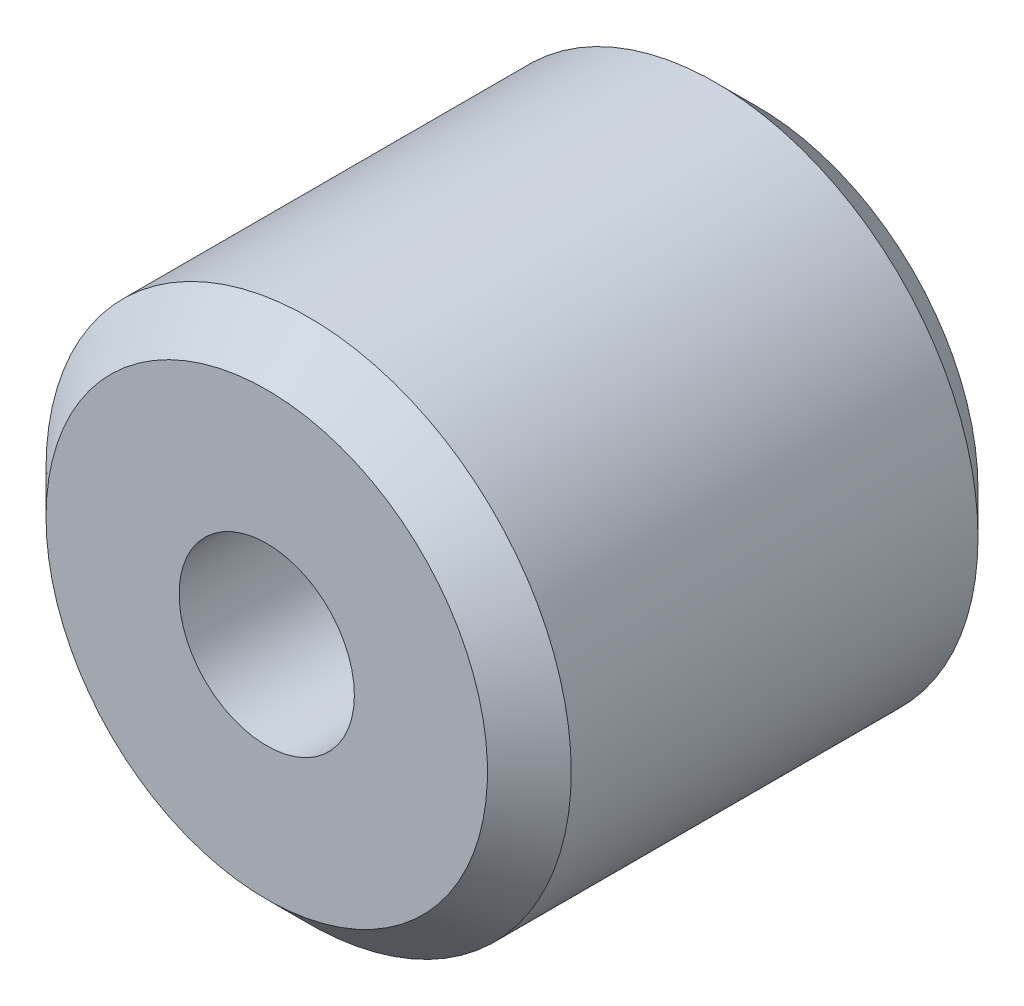
ISO-10303-21;
HEADER;
FILE_DESCRIPTION(('STEP AP214'),'2;1');
FILE_NAME('part.step','',(''),(''),'','','');
FILE_SCHEMA(('AUTOMOTIVE_DESIGN { 1 0 10303 214 1 1 1 1 }'));
ENDSEC;
DATA;
#1=APPLICATION_CONTEXT('core data for automotive mechanical design processes');
#2=APPLICATION_PROTOCOL_DEFINITION('international standard','automotive_design',2000,#1);
#3=PRODUCT_CONTEXT('',#1,'mechanical');
#4=PRODUCT('Part','Part','',(#3));
#5=PRODUCT_RELATED_PRODUCT_CATEGORY('part','',(#4));
#6=PRODUCT_DEFINITION_FORMATION('','',#4);
#7=PRODUCT_DEFINITION_CONTEXT('part definition',#1,'design');
#8=PRODUCT_DEFINITION('design','',#6,#7);
#9=PRODUCT_DEFINITION_SHAPE('','',#8);
#10=(LENGTH_UNIT() NAMED_UNIT(*) SI_UNIT(.MILLI.,.METRE.));
#11=(NAMED_UNIT(*) PLANE_ANGLE_UNIT() SI_UNIT($,.RADIAN.));
#12=(NAMED_UNIT(*) SI_UNIT($,.STERADIAN.) SOLID_ANGLE_UNIT());
#13=UNCERTAINTY_MEASURE_WITH_UNIT(LENGTH_MEASURE(1.E-05),#10,'distance_accuracy_value','');
#14=(GEOMETRIC_REPRESENTATION_CONTEXT(3) GLOBAL_UNCERTAINTY_ASSIGNED_CONTEXT((#13)) GLOBAL_UNIT_ASSIGNED_CONTEXT((#10,
#11,#12)) REPRESENTATION_CONTEXT('',''));
#15=CARTESIAN_POINT('',(0.,0.,0.));
#16=DIRECTION('',(0.,0.,1.));
#17=DIRECTION('',(1.,0.,0.));
#18=AXIS2_PLACEMENT_3D('',#15,#16,#17);
#19=CARTESIAN_POINT('',(0.,0.,4.45));
#20=DIRECTION('',(0.,0.,-1.));
#21=DIRECTION('',(-1.,0.,0.));
#22=AXIS2_PLACEMENT_3D('',#19,#20,#21);
#23=CYLINDRICAL_SURFACE('',#22,4.765);
#24=CARTESIAN_POINT('',(0.,0.,-3.69));
#25=DIRECTION('',(0.,0.,1.));
#26=DIRECTION('',(1.,0.,0.));
#27=AXIS2_PLACEMENT_3D('',#24,#25,#26);
#28=CIRCLE('',#27,4.765);
#29=CARTESIAN_POINT('',(-4.765,0.,-3.69));
#30=VERTEX_POINT('',#29);
#31=EDGE_CURVE('E53',#30,#30,#28,.T.);
#32=CARTESIAN_POINT('',(0.,0.,3.69));
#33=DIRECTION('',(0.,0.,1.));
#34=DIRECTION('',(1.,0.,0.));
#35=AXIS2_PLACEMENT_3D('',#32,#33,#34);
#36=CIRCLE('',#35,4.765);
#37=CARTESIAN_POINT('',(-4.765,0.,3.69));
#38=VERTEX_POINT('',#37);
#39=EDGE_CURVE('E58',#38,#38,#36,.F.);
#40=CARTESIAN_POINT('',(-4.765,0.,-3.69));
#41=CARTESIAN_POINT('',(-4.765,0.,-3.613125));
#42=CARTESIAN_POINT('',(-4.765,0.,-3.53625));
#43=CARTESIAN_POINT('',(-4.765,0.,-3.3825));
#44=CARTESIAN_POINT('',(-4.765,0.,-3.305625));
#45=CARTESIAN_POINT('',(-4.765,0.,-3.151875));
#46=CARTESIAN_POINT('',(-4.765,0.,-3.075));
#47=CARTESIAN_POINT('',(-4.765,0.,-2.92125));
#48=CARTESIAN_POINT('',(-4.765,0.,-2.844375));
#49=CARTESIAN_POINT('',(-4.765,0.,-2.690625));
#50=CARTESIAN_POINT('',(-4.765,0.,-2.61375));
#51=CARTESIAN_POINT('',(-4.765,0.,-2.46));
#52=CARTESIAN_POINT('',(-4.765,0.,-2.383125));
#53=CARTESIAN_POINT('',(-4.765,0.,-2.229375));
#54=CARTESIAN_POINT('',(-4.765,0.,-2.1525));
#55=CARTESIAN_POINT('',(-4.765,0.,-1.99875));
#56=CARTESIAN_POINT('',(-4.765,0.,-1.921875));
#57=CARTESIAN_POINT('',(-4.765,0.,-1.768125));
#58=CARTESIAN_POINT('',(-4.765,0.,-1.69125));
#59=CARTESIAN_POINT('',(-4.765,0.,-1.5375));
#60=CARTESIAN_POINT('',(-4.765,0.,-1.460625));
#61=CARTESIAN_POINT('',(-4.765,0.,-1.306875));
#62=CARTESIAN_POINT('',(-4.765,0.,-1.23));
#63=CARTESIAN_POINT('',(-4.765,0.,-1.07625));
#64=CARTESIAN_POINT('',(-4.765,0.,-0.999374999999999));
#65=CARTESIAN_POINT('',(-4.765,0.,-0.845625));
#66=CARTESIAN_POINT('',(-4.765,0.,-0.76875));
#67=CARTESIAN_POINT('',(-4.765,0.,-0.615));
#68=CARTESIAN_POINT('',(-4.765,0.,-0.538125));
#69=CARTESIAN_POINT('',(-4.765,0.,-0.384375));
#70=CARTESIAN_POINT('',(-4.765,0.,-0.3075));
#71=CARTESIAN_POINT('',(-4.765,0.,-0.15375));
#72=CARTESIAN_POINT('',(-4.765,0.,-0.076875));
#73=CARTESIAN_POINT('',(-4.765,0.,0.076875));
#74=CARTESIAN_POINT('',(-4.765,0.,0.15375));
#75=CARTESIAN_POINT('',(-4.765,0.,0.3075));
#76=CARTESIAN_POINT('',(-4.765,0.,0.384375));
#77=CARTESIAN_POINT('',(-4.765,0.,0.538125));
#78=CARTESIAN_POINT('',(-4.765,0.,0.615));
#79=CARTESIAN_POINT('',(-4.765,0.,0.76875));
#80=CARTESIAN_POINT('',(-4.765,0.,0.845625));
#81=CARTESIAN_POINT('',(-4.765,0.,0.999375));
#82=CARTESIAN_POINT('',(-4.765,0.,1.07625));
#83=CARTESIAN_POINT('',(-4.765,0.,1.23));
#84=CARTESIAN_POINT('',(-4.765,0.,1.306875));
#85=CARTESIAN_POINT('',(-4.765,0.,1.460625));
#86=CARTESIAN_POINT('',(-4.765,0.,1.5375));
#87=CARTESIAN_POINT('',(-4.765,0.,1.69125));
#88=CARTESIAN_POINT('',(-4.765,0.,1.768125));
#89=CARTESIAN_POINT('',(-4.765,0.,1.921875));
#90=CARTESIAN_POINT('',(-4.765,0.,1.99875));
#91=CARTESIAN_POINT('',(-4.765,0.,2.1525));
#92=CARTESIAN_POINT('',(-4.765,0.,2.229375));
#93=CARTESIAN_POINT('',(-4.765,0.,2.383125));
#94=CARTESIAN_POINT('',(-4.765,0.,2.46));
#95=CARTESIAN_POINT('',(-4.765,0.,2.61375));
#96=CARTESIAN_POINT('',(-4.765,0.,2.690625));
#97=CARTESIAN_POINT('',(-4.765,0.,2.844375));
#98=CARTESIAN_POINT('',(-4.765,0.,2.92125));
#99=CARTESIAN_POINT('',(-4.765,0.,3.075));
#100=CARTESIAN_POINT('',(-4.765,0.,3.151875));
#101=CARTESIAN_POINT('',(-4.765,0.,3.305625));
#102=CARTESIAN_POINT('',(-4.765,0.,3.3825));
#103=CARTESIAN_POINT('',(-4.765,0.,3.53625));
#104=CARTESIAN_POINT('',(-4.765,0.,3.613125));
#105=CARTESIAN_POINT('',(-4.765,0.,3.69));
#106=B_SPLINE_CURVE_WITH_KNOTS('',3,(#40,#41,#42,#43,#44,#45,#46,#47,#48,#49,#50,#51,#52,#53,
#54,#55,#56,#57,#58,#59,#60,#61,#62,#63,#64,#65,#66,#67,#68,#69,#70,#71,#72,#73,#74,#75,#76,#77,
#78,#79,#80,#81,#82,#83,#84,#85,#86,#87,#88,#89,#90,#91,#92,#93,#94,#95,#96,#97,#98,#99,#100,
#101,#102,#103,#104,#105),.UNSPECIFIED.,.F.,.F.,(4,2,2,2,2,2,2,2,2,2,2,2,2,2,2,2,2,2,2,2,2,2,2,
2,2,2,2,2,2,2,2,2,4),(0.,0.230625,0.46125,0.691875,0.9225,1.153125,1.38375,1.614375,1.845,
2.075625,2.30625,2.536875,2.7675,2.998125,3.22875,3.459375,3.69,3.920625,4.15125,4.381875,
4.6125,4.843125,5.07375,5.304375,5.535,5.765625,5.99625,6.226875,6.4575,6.688125,6.91875,
7.149375,7.38),.UNSPECIFIED.);
#107=EDGE_CURVE('BSEAM39',#30,#38,#106,.T.);
#108=ORIENTED_EDGE('',*,*,#31,.T.);
#109=ORIENTED_EDGE('',*,*,#39,.T.);
#110=ORIENTED_EDGE('',*,*,#107,.T.);
#111=ORIENTED_EDGE('',*,*,#107,.F.);
#112=EDGE_LOOP('',(#108,#110,#109,#111));
#113=FACE_BOUND('',#112,.T.);
#114=ADVANCED_FACE('F39',(#113),#23,.T.);
#115=CARTESIAN_POINT('',(0.,0.,4.45));
#116=DIRECTION('',(0.,0.,1.));
#117=DIRECTION('',(1.,0.,0.));
#118=AXIS2_PLACEMENT_3D('',#115,#116,#117);
#119=PLANE('',#118);
#120=CARTESIAN_POINT('',(0.,0.,4.45));
#121=DIRECTION('',(0.,0.,1.));
#122=DIRECTION('',(1.,0.,0.));
#123=AXIS2_PLACEMENT_3D('',#120,#121,#122);
#124=CIRCLE('',#123,1.59);
#125=CARTESIAN_POINT('',(1.59,0.,4.45));
#126=VERTEX_POINT('',#125);
#127=EDGE_CURVE('E68',#126,#126,#124,.T.);
#128=ORIENTED_EDGE('',*,*,#127,.F.);
#129=EDGE_LOOP('',(#128));
#130=FACE_BOUND('',#129,.T.);
#131=CARTESIAN_POINT('',(0.,0.,4.45));
#132=DIRECTION('',(0.,0.,1.));
#133=DIRECTION('',(1.,0.,0.));
#134=AXIS2_PLACEMENT_3D('',#131,#132,#133);
#135=CIRCLE('',#134,4.005);
#136=CARTESIAN_POINT('',(-4.005,0.,4.45));
#137=VERTEX_POINT('',#136);
#138=EDGE_CURVE('E10',#137,#137,#135,.T.);
#139=ORIENTED_EDGE('',*,*,#138,.T.);
#140=EDGE_LOOP('',(#139));
#141=FACE_BOUND('',#140,.T.);
#142=ADVANCED_FACE('F75',(#130,#141),#119,.T.);
#143=CARTESIAN_POINT('',(0.,0.,-4.45));
#144=DIRECTION('',(0.,0.,1.));
#145=DIRECTION('',(1.,0.,0.));
#146=AXIS2_PLACEMENT_3D('',#143,#144,#145);
#147=PLANE('',#146);
#148=CARTESIAN_POINT('',(0.,0.,-4.45));
#149=DIRECTION('',(0.,0.,1.));
#150=DIRECTION('',(1.,0.,0.));
#151=AXIS2_PLACEMENT_3D('',#148,#149,#150);
#152=CIRCLE('',#151,1.59);
#153=CARTESIAN_POINT('',(1.59,0.,-4.45));
#154=VERTEX_POINT('',#153);
#155=EDGE_CURVE('E64',#154,#154,#152,.T.);
#156=ORIENTED_EDGE('',*,*,#155,.T.);
#157=EDGE_LOOP('',(#156));
#158=FACE_BOUND('',#157,.T.);
#159=CARTESIAN_POINT('',(0.,0.,-4.45));
#160=DIRECTION('',(0.,0.,1.));
#161=DIRECTION('',(1.,0.,0.));
#162=AXIS2_PLACEMENT_3D('',#159,#160,#161);
#163=CIRCLE('',#162,4.00499999999999);
#164=CARTESIAN_POINT('',(4.00499999999999,0.,-4.45));
#165=VERTEX_POINT('',#164);
#166=EDGE_CURVE('E48',#165,#165,#163,.F.);
#167=ORIENTED_EDGE('',*,*,#166,.T.);
#168=EDGE_LOOP('',(#167));
#169=FACE_BOUND('',#168,.T.);
#170=ADVANCED_FACE('F77',(#158,#169),#147,.F.);
#171=CARTESIAN_POINT('',(0.,0.,-3.69));
#172=DIRECTION('',(0.,0.,1.));
#173=DIRECTION('',(1.,0.,0.));
#174=AXIS2_PLACEMENT_3D('',#171,#172,#173);
#175=CONICAL_SURFACE('',#174,4.765,0.785398163397451);
#176=ORIENTED_EDGE('',*,*,#166,.F.);
#177=EDGE_LOOP('',(#176));
#178=FACE_BOUND('',#177,.T.);
#179=ORIENTED_EDGE('',*,*,#31,.F.);
#180=EDGE_LOOP('',(#179));
#181=FACE_BOUND('',#180,.T.);
#182=ADVANCED_FACE('F83',(#178,#181),#175,.T.);
#183=CARTESIAN_POINT('',(0.,0.,4.45));
#184=DIRECTION('',(0.,0.,-1.));
#185=DIRECTION('',(-1.,0.,0.));
#186=AXIS2_PLACEMENT_3D('',#183,#184,#185);
#187=CONICAL_SURFACE('',#186,4.005,0.785398163397447);
#188=CARTESIAN_POINT('',(-4.765,0.,3.69));
#189=CARTESIAN_POINT('',(-4.75708333333333,0.,3.69791666666666));
#190=CARTESIAN_POINT('',(-4.74916666666667,0.,3.70583333333333));
#191=CARTESIAN_POINT('',(-4.73333333333333,0.,3.72166666666666));
#192=CARTESIAN_POINT('',(-4.72541666666667,0.,3.72958333333333));
#193=CARTESIAN_POINT('',(-4.70958333333333,0.,3.74541666666666));
#194=CARTESIAN_POINT('',(-4.70166666666667,0.,3.75333333333333));
#195=CARTESIAN_POINT('',(-4.68583333333333,0.,3.76916666666666));
#196=CARTESIAN_POINT('',(-4.67791666666667,0.,3.77708333333333));
#197=CARTESIAN_POINT('',(-4.66208333333333,0.,3.79291666666666));
#198=CARTESIAN_POINT('',(-4.65416666666667,0.,3.80083333333333));
#199=CARTESIAN_POINT('',(-4.63833333333333,0.,3.81666666666666));
#200=CARTESIAN_POINT('',(-4.63041666666667,0.,3.82458333333333));
#201=CARTESIAN_POINT('',(-4.61458333333333,0.,3.84041666666667));
#202=CARTESIAN_POINT('',(-4.60666666666667,0.,3.84833333333333));
#203=CARTESIAN_POINT('',(-4.59083333333333,0.,3.86416666666666));
#204=CARTESIAN_POINT('',(-4.58291666666667,0.,3.87208333333333));
#205=CARTESIAN_POINT('',(-4.56708333333333,0.,3.88791666666667));
#206=CARTESIAN_POINT('',(-4.55916666666667,0.,3.89583333333333));
#207=CARTESIAN_POINT('',(-4.54333333333333,0.,3.91166666666666));
#208=CARTESIAN_POINT('',(-4.53541666666666,0.,3.91958333333333));
#209=CARTESIAN_POINT('',(-4.51958333333333,0.,3.93541666666667));
#210=CARTESIAN_POINT('',(-4.51166666666667,0.,3.94333333333333));
#211=CARTESIAN_POINT('',(-4.49583333333333,0.,3.95916666666666));
#212=CARTESIAN_POINT('',(-4.48791666666667,0.,3.96708333333333));
#213=CARTESIAN_POINT('',(-4.47208333333333,0.,3.98291666666666));
#214=CARTESIAN_POINT('',(-4.46416666666666,0.,3.99083333333333));
#215=CARTESIAN_POINT('',(-4.44833333333333,0.,4.00666666666667));
#216=CARTESIAN_POINT('',(-4.44041666666667,0.,4.01458333333333));
#217=CARTESIAN_POINT('',(-4.42458333333333,0.,4.03041666666666));
#218=CARTESIAN_POINT('',(-4.41666666666667,0.,4.03833333333333));
#219=CARTESIAN_POINT('',(-4.40083333333333,0.,4.05416666666667));
#220=CARTESIAN_POINT('',(-4.39291666666666,0.,4.06208333333333));
#221=CARTESIAN_POINT('',(-4.37708333333333,0.,4.07791666666667));
#222=CARTESIAN_POINT('',(-4.36916666666666,0.,4.08583333333333));
#223=CARTESIAN_POINT('',(-4.35333333333333,0.,4.10166666666666));
#224=CARTESIAN_POINT('',(-4.34541666666667,0.,4.10958333333333));
#225=CARTESIAN_POINT('',(-4.32958333333333,0.,4.12541666666667));
#226=CARTESIAN_POINT('',(-4.32166666666667,0.,4.13333333333333));
#227=CARTESIAN_POINT('',(-4.30583333333333,0.,4.14916666666667));
#228=CARTESIAN_POINT('',(-4.29791666666666,0.,4.15708333333333));
#229=CARTESIAN_POINT('',(-4.28208333333333,0.,4.17291666666666));
#230=CARTESIAN_POINT('',(-4.27416666666667,0.,4.18083333333333));
#231=CARTESIAN_POINT('',(-4.25833333333333,0.,4.19666666666667));
#232=CARTESIAN_POINT('',(-4.25041666666667,0.,4.20458333333333));
#233=CARTESIAN_POINT('',(-4.23458333333333,0.,4.22041666666667));
#234=CARTESIAN_POINT('',(-4.22666666666666,0.,4.22833333333333));
#235=CARTESIAN_POINT('',(-4.21083333333333,0.,4.24416666666666));
#236=CARTESIAN_POINT('',(-4.20291666666667,0.,4.25208333333333));
#237=CARTESIAN_POINT('',(-4.18708333333333,0.,4.26791666666667));
#238=CARTESIAN_POINT('',(-4.17916666666667,0.,4.27583333333333));
#239=CARTESIAN_POINT('',(-4.16333333333333,0.,4.29166666666667));
#240=CARTESIAN_POINT('',(-4.15541666666666,0.,4.29958333333333));
#241=CARTESIAN_POINT('',(-4.13958333333333,0.,4.31541666666666));
#242=CARTESIAN_POINT('',(-4.13166666666667,0.,4.32333333333333));
#243=CARTESIAN_POINT('',(-4.11583333333333,0.,4.33916666666667));
#244=CARTESIAN_POINT('',(-4.10791666666667,0.,4.34708333333333));
#245=CARTESIAN_POINT('',(-4.09208333333333,0.,4.36291666666667));
#246=CARTESIAN_POINT('',(-4.08416666666666,0.,4.37083333333333));
#247=CARTESIAN_POINT('',(-4.06833333333333,0.,4.38666666666667));
#248=CARTESIAN_POINT('',(-4.06041666666667,0.,4.39458333333333));
#249=CARTESIAN_POINT('',(-4.04458333333333,0.,4.41041666666667));
#250=CARTESIAN_POINT('',(-4.03666666666667,0.,4.41833333333333));
#251=CARTESIAN_POINT('',(-4.02083333333333,0.,4.43416666666667));
#252=CARTESIAN_POINT('',(-4.01291666666666,0.,4.44208333333333));
#253=CARTESIAN_POINT('',(-4.005,0.,4.45));
#254=B_SPLINE_CURVE_WITH_KNOTS('',3,(#188,#189,#190,#191,#192,#193,#194,#195,#196,#197,#198,
#199,#200,#201,#202,#203,#204,#205,#206,#207,#208,#209,#210,#211,#212,#213,#214,#215,#216,#217,
#218,#219,#220,#221,#222,#223,#224,#225,#226,#227,#228,#229,#230,#231,#232,#233,#234,#235,#236,
#237,#238,#239,#240,#241,#242,#243,#244,#245,#246,#247,#248,#249,#250,#251,#252,#253),
.UNSPECIFIED.,.F.,.F.,(4,2,2,2,2,2,2,2,2,2,2,2,2,2,2,2,2,2,2,2,2,2,2,2,2,2,2,2,2,2,2,2,4),(0.,
0.0335875721063609,0.067175144212722,0.100762716319083,0.134350288425444,0.167937860531805,
0.201525432638166,0.235113004744527,0.268700576850888,0.302288148957249,0.335875721063611,
0.369463293169971,0.403050865276333,0.436638437382694,0.470226009489054,0.503813581595416,
0.537401153701777,0.570988725808138,0.604576297914499,0.63816387002086,0.671751442127221,
0.705339014233582,0.738926586339943,0.772514158446304,0.806101730552665,0.839689302659026,
0.873276874765387,0.906864446871748,0.940452018978109,0.974039591084471,1.00762716319083,
1.04121473529719,1.07480230740355),.UNSPECIFIED.);
#255=EDGE_CURVE('BSEAM42',#38,#137,#254,.T.);
#256=ORIENTED_EDGE('',*,*,#39,.F.);
#257=ORIENTED_EDGE('',*,*,#138,.F.);
#258=ORIENTED_EDGE('',*,*,#255,.T.);
#259=ORIENTED_EDGE('',*,*,#255,.F.);
#260=EDGE_LOOP('',(#256,#258,#257,#259));
#261=FACE_BOUND('',#260,.T.);
#262=ADVANCED_FACE('F42',(#261),#187,.T.);
#263=CARTESIAN_POINT('',(0.,0.,-4.45));
#264=DIRECTION('',(0.,0.,1.));
#265=DIRECTION('',(1.,0.,0.));
#266=AXIS2_PLACEMENT_3D('',#263,#264,#265);
#267=CYLINDRICAL_SURFACE('',#266,1.59);
#268=ORIENTED_EDGE('',*,*,#155,.F.);
#269=EDGE_LOOP('',(#268));
#270=FACE_BOUND('',#269,.T.);
#271=ORIENTED_EDGE('',*,*,#127,.T.);
#272=EDGE_LOOP('',(#271));
#273=FACE_BOUND('',#272,.T.);
#274=ADVANCED_FACE('F73',(#270,#273),#267,.F.);
#275=CLOSED_SHELL('',(#114,#142,#170,#182,#262,#274));
#276=MANIFOLD_SOLID_BREP('B2',#275);
#277=ADVANCED_BREP_SHAPE_REPRESENTATION('',(#18,#276),#14);
#278=SHAPE_DEFINITION_REPRESENTATION(#9,#277);
ENDSEC;
END-ISO-10303-21;
